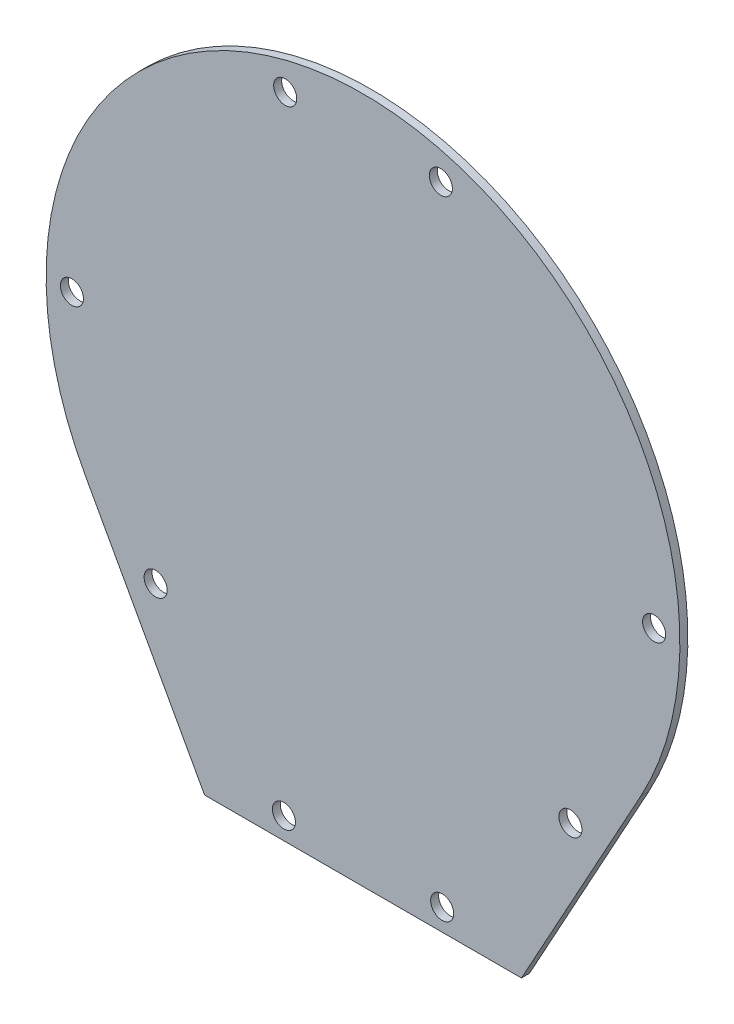
ISO-10303-21;
HEADER;
FILE_DESCRIPTION(('STEP AP214'),'2;1');
FILE_NAME('part.step','',(''),(''),'','','');
FILE_SCHEMA(('AUTOMOTIVE_DESIGN { 1 0 10303 214 1 1 1 1 }'));
ENDSEC;
DATA;
#1=APPLICATION_CONTEXT('core data for automotive mechanical design processes');
#2=APPLICATION_PROTOCOL_DEFINITION('international standard','automotive_design',2000,#1);
#3=PRODUCT_CONTEXT('',#1,'mechanical');
#4=PRODUCT('Part','Part','',(#3));
#5=PRODUCT_RELATED_PRODUCT_CATEGORY('part','',(#4));
#6=PRODUCT_DEFINITION_FORMATION('','',#4);
#7=PRODUCT_DEFINITION_CONTEXT('part definition',#1,'design');
#8=PRODUCT_DEFINITION('design','',#6,#7);
#9=PRODUCT_DEFINITION_SHAPE('','',#8);
#10=(LENGTH_UNIT() NAMED_UNIT(*) SI_UNIT(.MILLI.,.METRE.));
#11=(NAMED_UNIT(*) PLANE_ANGLE_UNIT() SI_UNIT($,.RADIAN.));
#12=(NAMED_UNIT(*) SI_UNIT($,.STERADIAN.) SOLID_ANGLE_UNIT());
#13=UNCERTAINTY_MEASURE_WITH_UNIT(LENGTH_MEASURE(1.E-05),#10,'distance_accuracy_value','');
#14=(GEOMETRIC_REPRESENTATION_CONTEXT(3) GLOBAL_UNCERTAINTY_ASSIGNED_CONTEXT((#13)) GLOBAL_UNIT_ASSIGNED_CONTEXT((#10,
#11,#12)) REPRESENTATION_CONTEXT('',''));
#15=CARTESIAN_POINT('',(0.,0.,0.));
#16=DIRECTION('',(0.,0.,1.));
#17=DIRECTION('',(1.,0.,0.));
#18=AXIS2_PLACEMENT_3D('',#15,#16,#17);
#19=CARTESIAN_POINT('',(0.,0.,0.75438));
#20=DIRECTION('',(0.,0.,1.));
#21=DIRECTION('',(1.,0.,0.));
#22=AXIS2_PLACEMENT_3D('',#19,#20,#21);
#23=PLANE('',#22);
#24=CARTESIAN_POINT('',(27.559,-0.045002199999999,0.75438));
#25=DIRECTION('',(0.,0.,1.));
#26=DIRECTION('',(1.,0.,0.));
#27=AXIS2_PLACEMENT_3D('',#24,#25,#26);
#28=CIRCLE('',#27,1.09200001);
#29=CARTESIAN_POINT('',(28.65100001,-0.045002199999999,0.75438));
#30=VERTEX_POINT('',#29);
#31=EDGE_CURVE('E228',#30,#30,#28,.F.);
#32=ORIENTED_EDGE('',*,*,#31,.T.);
#33=EDGE_LOOP('',(#32));
#34=FACE_BOUND('',#33,.T.);
#35=CARTESIAN_POINT('',(19.634,-19.9840012,0.75438));
#36=DIRECTION('',(0.,0.,1.));
#37=DIRECTION('',(1.,0.,0.));
#38=AXIS2_PLACEMENT_3D('',#35,#36,#37);
#39=CIRCLE('',#38,1.09200001);
#40=CARTESIAN_POINT('',(20.72600001,-19.9840012,0.75438));
#41=VERTEX_POINT('',#40);
#42=EDGE_CURVE('E237',#41,#41,#39,.F.);
#43=ORIENTED_EDGE('',*,*,#42,.T.);
#44=EDGE_LOOP('',(#43));
#45=FACE_BOUND('',#44,.T.);
#46=CARTESIAN_POINT('',(7.4931,-32.938,0.75438));
#47=DIRECTION('',(0.,0.,1.));
#48=DIRECTION('',(1.,0.,0.));
#49=AXIS2_PLACEMENT_3D('',#46,#47,#48);
#50=CIRCLE('',#49,1.09200001);
#51=CARTESIAN_POINT('',(8.58510001,-32.938,0.75438));
#52=VERTEX_POINT('',#51);
#53=EDGE_CURVE('E232',#52,#52,#50,.F.);
#54=ORIENTED_EDGE('',*,*,#53,.T.);
#55=EDGE_LOOP('',(#54));
#56=FACE_BOUND('',#55,.T.);
#57=CARTESIAN_POINT('',(7.366,26.4469878,0.75438));
#58=DIRECTION('',(0.,0.,1.));
#59=DIRECTION('',(1.,0.,0.));
#60=AXIS2_PLACEMENT_3D('',#57,#58,#59);
#61=CIRCLE('',#60,1.09200001);
#62=CARTESIAN_POINT('',(8.45800001,26.4469878,0.75438));
#63=VERTEX_POINT('',#62);
#64=EDGE_CURVE('E135',#63,#63,#61,.F.);
#65=ORIENTED_EDGE('',*,*,#64,.T.);
#66=EDGE_LOOP('',(#65));
#67=FACE_BOUND('',#66,.T.);
#68=DIRECTION('',(0.481530219319478,0.876429488254552,0.));
#69=VECTOR('',#68,1.);
#70=CARTESIAN_POINT('',(26.2928846476366,-14.4459065795843,0.75438));
#71=LINE('',#70,#69);
#72=CARTESIAN_POINT('',(15.,-35.,0.75438));
#73=VERTEX_POINT('',#72);
#74=CARTESIAN_POINT('',(26.2928846476366,-14.4459065795843,0.75438));
#75=VERTEX_POINT('',#74);
#76=EDGE_CURVE('E95',#73,#75,#71,.T.);
#77=ORIENTED_EDGE('',*,*,#76,.T.);
#78=CARTESIAN_POINT('',(0.,0.,0.75438));
#79=DIRECTION('',(0.,0.,1.));
#80=DIRECTION('',(1.,0.,0.));
#81=AXIS2_PLACEMENT_3D('',#78,#79,#80);
#82=CIRCLE('',#81,30.);
#83=CARTESIAN_POINT('',(-26.2928846476366,-14.4459065795843,0.75438));
#84=VERTEX_POINT('',#83);
#85=EDGE_CURVE('E90',#75,#84,#82,.T.);
#86=ORIENTED_EDGE('',*,*,#85,.T.);
#87=DIRECTION('',(-0.481530219319478,0.876429488254552,0.));
#88=VECTOR('',#87,1.);
#89=CARTESIAN_POINT('',(-26.2928846476366,-14.4459065795843,0.75438));
#90=LINE('',#89,#88);
#91=CARTESIAN_POINT('',(-15.,-35.,0.75438));
#92=VERTEX_POINT('',#91);
#93=EDGE_CURVE('E93',#92,#84,#90,.T.);
#94=ORIENTED_EDGE('',*,*,#93,.F.);
#95=DIRECTION('',(1.,0.,0.));
#96=VECTOR('',#95,1.);
#97=CARTESIAN_POINT('',(0.,-35.,0.75438));
#98=LINE('',#97,#96);
#99=EDGE_CURVE('E64',#92,#73,#98,.T.);
#100=ORIENTED_EDGE('',*,*,#99,.T.);
#101=EDGE_LOOP('',(#77,#86,#94,#100));
#102=FACE_BOUND('',#101,.T.);
#103=CARTESIAN_POINT('',(-7.366,26.4469878,0.75438));
#104=DIRECTION('',(0.,0.,1.));
#105=DIRECTION('',(1.,0.,0.));
#106=AXIS2_PLACEMENT_3D('',#103,#104,#105);
#107=CIRCLE('',#106,1.09200001);
#108=CARTESIAN_POINT('',(-6.27399999,26.4469878,0.75438));
#109=VERTEX_POINT('',#108);
#110=EDGE_CURVE('E243',#109,#109,#107,.T.);
#111=ORIENTED_EDGE('',*,*,#110,.F.);
#112=EDGE_LOOP('',(#111));
#113=FACE_BOUND('',#112,.T.);
#114=CARTESIAN_POINT('',(-27.559,-0.045002199999999,0.75438));
#115=DIRECTION('',(0.,0.,1.));
#116=DIRECTION('',(1.,0.,0.));
#117=AXIS2_PLACEMENT_3D('',#114,#115,#116);
#118=CIRCLE('',#117,1.09200001);
#119=CARTESIAN_POINT('',(-26.46699999,-0.045002199999999,0.75438));
#120=VERTEX_POINT('',#119);
#121=EDGE_CURVE('E247',#120,#120,#118,.T.);
#122=ORIENTED_EDGE('',*,*,#121,.F.);
#123=EDGE_LOOP('',(#122));
#124=FACE_BOUND('',#123,.T.);
#125=CARTESIAN_POINT('',(-19.634,-19.9840012,0.75438));
#126=DIRECTION('',(0.,0.,1.));
#127=DIRECTION('',(1.,0.,0.));
#128=AXIS2_PLACEMENT_3D('',#125,#126,#127);
#129=CIRCLE('',#128,1.09200001);
#130=CARTESIAN_POINT('',(-18.54199999,-19.9840012,0.75438));
#131=VERTEX_POINT('',#130);
#132=EDGE_CURVE('E233',#131,#131,#129,.T.);
#133=ORIENTED_EDGE('',*,*,#132,.F.);
#134=EDGE_LOOP('',(#133));
#135=FACE_BOUND('',#134,.T.);
#136=CARTESIAN_POINT('',(-7.4931,-32.938,0.75438));
#137=DIRECTION('',(0.,0.,1.));
#138=DIRECTION('',(1.,0.,0.));
#139=AXIS2_PLACEMENT_3D('',#136,#137,#138);
#140=CIRCLE('',#139,1.09200001);
#141=CARTESIAN_POINT('',(-6.40109999,-32.938,0.75438));
#142=VERTEX_POINT('',#141);
#143=EDGE_CURVE('E229',#142,#142,#140,.T.);
#144=ORIENTED_EDGE('',*,*,#143,.F.);
#145=EDGE_LOOP('',(#144));
#146=FACE_BOUND('',#145,.T.);
#147=ADVANCED_FACE('F44',(#34,#45,#56,#67,#102,#113,#124,#135,#146),#23,.T.);
#148=CARTESIAN_POINT('',(0.,0.,0.));
#149=DIRECTION('',(0.,0.,1.));
#150=DIRECTION('',(1.,0.,0.));
#151=AXIS2_PLACEMENT_3D('',#148,#149,#150);
#152=PLANE('',#151);
#153=CARTESIAN_POINT('',(27.559,-0.045002199999999,0.));
#154=DIRECTION('',(0.,0.,1.));
#155=DIRECTION('',(1.,0.,0.));
#156=AXIS2_PLACEMENT_3D('',#153,#154,#155);
#157=CIRCLE('',#156,1.09200001);
#158=CARTESIAN_POINT('',(28.65100001,-0.045002199999999,0.));
#159=VERTEX_POINT('',#158);
#160=EDGE_CURVE('E48',#159,#159,#157,.F.);
#161=ORIENTED_EDGE('',*,*,#160,.F.);
#162=EDGE_LOOP('',(#161));
#163=FACE_BOUND('',#162,.T.);
#164=CARTESIAN_POINT('',(19.634,-19.9840012,0.));
#165=DIRECTION('',(0.,0.,1.));
#166=DIRECTION('',(1.,0.,0.));
#167=AXIS2_PLACEMENT_3D('',#164,#165,#166);
#168=CIRCLE('',#167,1.09200001);
#169=CARTESIAN_POINT('',(20.72600001,-19.9840012,0.));
#170=VERTEX_POINT('',#169);
#171=EDGE_CURVE('E154',#170,#170,#168,.F.);
#172=ORIENTED_EDGE('',*,*,#171,.F.);
#173=EDGE_LOOP('',(#172));
#174=FACE_BOUND('',#173,.T.);
#175=CARTESIAN_POINT('',(7.4931,-32.938,0.));
#176=DIRECTION('',(0.,0.,1.));
#177=DIRECTION('',(1.,0.,0.));
#178=AXIS2_PLACEMENT_3D('',#175,#176,#177);
#179=CIRCLE('',#178,1.09200001);
#180=CARTESIAN_POINT('',(8.58510001,-32.938,0.));
#181=VERTEX_POINT('',#180);
#182=EDGE_CURVE('E151',#181,#181,#179,.F.);
#183=ORIENTED_EDGE('',*,*,#182,.F.);
#184=EDGE_LOOP('',(#183));
#185=FACE_BOUND('',#184,.T.);
#186=CARTESIAN_POINT('',(-19.634,-19.9840012,0.));
#187=DIRECTION('',(0.,0.,1.));
#188=DIRECTION('',(1.,0.,0.));
#189=AXIS2_PLACEMENT_3D('',#186,#187,#188);
#190=CIRCLE('',#189,1.09200001);
#191=CARTESIAN_POINT('',(-18.54199999,-19.9840012,0.));
#192=VERTEX_POINT('',#191);
#193=EDGE_CURVE('E143',#192,#192,#190,.T.);
#194=ORIENTED_EDGE('',*,*,#193,.T.);
#195=EDGE_LOOP('',(#194));
#196=FACE_BOUND('',#195,.T.);
#197=CARTESIAN_POINT('',(-7.366,26.4469878,0.));
#198=DIRECTION('',(0.,0.,1.));
#199=DIRECTION('',(1.,0.,0.));
#200=AXIS2_PLACEMENT_3D('',#197,#198,#199);
#201=CIRCLE('',#200,1.09200001);
#202=CARTESIAN_POINT('',(-6.27399999,26.4469878,0.));
#203=VERTEX_POINT('',#202);
#204=EDGE_CURVE('E134',#203,#203,#201,.T.);
#205=ORIENTED_EDGE('',*,*,#204,.T.);
#206=EDGE_LOOP('',(#205));
#207=FACE_BOUND('',#206,.T.);
#208=CARTESIAN_POINT('',(7.366,26.4469878,0.));
#209=DIRECTION('',(0.,0.,1.));
#210=DIRECTION('',(1.,0.,0.));
#211=AXIS2_PLACEMENT_3D('',#208,#209,#210);
#212=CIRCLE('',#211,1.09200001);
#213=CARTESIAN_POINT('',(8.45800001,26.4469878,0.));
#214=VERTEX_POINT('',#213);
#215=EDGE_CURVE('E130',#214,#214,#212,.F.);
#216=ORIENTED_EDGE('',*,*,#215,.F.);
#217=EDGE_LOOP('',(#216));
#218=FACE_BOUND('',#217,.T.);
#219=DIRECTION('',(0.481530219319478,0.876429488254552,0.));
#220=VECTOR('',#219,1.);
#221=CARTESIAN_POINT('',(26.2928846476366,-14.4459065795843,0.));
#222=LINE('',#221,#220);
#223=CARTESIAN_POINT('',(15.,-35.,0.));
#224=VERTEX_POINT('',#223);
#225=CARTESIAN_POINT('',(26.2928846476366,-14.4459065795843,0.));
#226=VERTEX_POINT('',#225);
#227=EDGE_CURVE('E115',#224,#226,#222,.T.);
#228=ORIENTED_EDGE('',*,*,#227,.F.);
#229=DIRECTION('',(1.,0.,0.));
#230=VECTOR('',#229,1.);
#231=CARTESIAN_POINT('',(0.,-35.,0.));
#232=LINE('',#231,#230);
#233=CARTESIAN_POINT('',(-15.,-35.,0.));
#234=VERTEX_POINT('',#233);
#235=EDGE_CURVE('E83',#234,#224,#232,.T.);
#236=ORIENTED_EDGE('',*,*,#235,.F.);
#237=DIRECTION('',(-0.481530219319478,0.876429488254552,0.));
#238=VECTOR('',#237,1.);
#239=CARTESIAN_POINT('',(-26.2928846476366,-14.4459065795843,0.));
#240=LINE('',#239,#238);
#241=CARTESIAN_POINT('',(-26.2928846476366,-14.4459065795843,0.));
#242=VERTEX_POINT('',#241);
#243=EDGE_CURVE('E121',#234,#242,#240,.T.);
#244=ORIENTED_EDGE('',*,*,#243,.T.);
#245=CARTESIAN_POINT('',(0.,0.,0.));
#246=DIRECTION('',(0.,0.,1.));
#247=DIRECTION('',(1.,0.,0.));
#248=AXIS2_PLACEMENT_3D('',#245,#246,#247);
#249=CIRCLE('',#248,30.);
#250=EDGE_CURVE('E101',#226,#242,#249,.T.);
#251=ORIENTED_EDGE('',*,*,#250,.F.);
#252=EDGE_LOOP('',(#228,#236,#244,#251));
#253=FACE_BOUND('',#252,.T.);
#254=CARTESIAN_POINT('',(-27.559,-0.045002199999999,0.));
#255=DIRECTION('',(0.,0.,1.));
#256=DIRECTION('',(1.,0.,0.));
#257=AXIS2_PLACEMENT_3D('',#254,#255,#256);
#258=CIRCLE('',#257,1.09200001);
#259=CARTESIAN_POINT('',(-26.46699999,-0.045002199999999,0.));
#260=VERTEX_POINT('',#259);
#261=EDGE_CURVE('E139',#260,#260,#258,.T.);
#262=ORIENTED_EDGE('',*,*,#261,.T.);
#263=EDGE_LOOP('',(#262));
#264=FACE_BOUND('',#263,.T.);
#265=CARTESIAN_POINT('',(-7.4931,-32.938,0.));
#266=DIRECTION('',(0.,0.,1.));
#267=DIRECTION('',(1.,0.,0.));
#268=AXIS2_PLACEMENT_3D('',#265,#266,#267);
#269=CIRCLE('',#268,1.09200001);
#270=CARTESIAN_POINT('',(-6.40109999,-32.938,0.));
#271=VERTEX_POINT('',#270);
#272=EDGE_CURVE('E147',#271,#271,#269,.T.);
#273=ORIENTED_EDGE('',*,*,#272,.T.);
#274=EDGE_LOOP('',(#273));
#275=FACE_BOUND('',#274,.T.);
#276=ADVANCED_FACE('F165',(#163,#174,#185,#196,#207,#218,#253,#264,#275),#152,.F.);
#277=CARTESIAN_POINT('',(26.2928846476366,-14.4459065795843,0.75438));
#278=DIRECTION('',(-0.876429488254551,0.481530219319478,0.));
#279=DIRECTION('',(-0.481530219319478,-0.876429488254552,0.));
#280=AXIS2_PLACEMENT_3D('',#277,#278,#279);
#281=PLANE('',#280);
#282=ORIENTED_EDGE('',*,*,#227,.T.);
#283=DIRECTION('',(0.,0.,-1.));
#284=VECTOR('',#283,1.);
#285=CARTESIAN_POINT('',(26.2928846476366,-14.4459065795843,0.75438));
#286=LINE('',#285,#284);
#287=EDGE_CURVE('E11',#75,#226,#286,.T.);
#288=ORIENTED_EDGE('',*,*,#287,.F.);
#289=ORIENTED_EDGE('',*,*,#76,.F.);
#290=DIRECTION('',(0.,0.,-1.));
#291=VECTOR('',#290,1.);
#292=CARTESIAN_POINT('',(15.,-35.,0.75438));
#293=LINE('',#292,#291);
#294=EDGE_CURVE('E111',#73,#224,#293,.T.);
#295=ORIENTED_EDGE('',*,*,#294,.T.);
#296=EDGE_LOOP('',(#282,#288,#289,#295));
#297=FACE_BOUND('',#296,.T.);
#298=ADVANCED_FACE('F46',(#297),#281,.F.);
#299=CARTESIAN_POINT('',(0.,0.,0.75438));
#300=DIRECTION('',(0.,0.,-1.));
#301=DIRECTION('',(-1.,0.,0.));
#302=AXIS2_PLACEMENT_3D('',#299,#300,#301);
#303=CYLINDRICAL_SURFACE('',#302,30.);
#304=ORIENTED_EDGE('',*,*,#250,.T.);
#305=DIRECTION('',(0.,0.,-1.));
#306=VECTOR('',#305,1.);
#307=CARTESIAN_POINT('',(-26.2928846476366,-14.4459065795843,0.75438));
#308=LINE('',#307,#306);
#309=EDGE_CURVE('E55',#84,#242,#308,.T.);
#310=ORIENTED_EDGE('',*,*,#309,.F.);
#311=ORIENTED_EDGE('',*,*,#85,.F.);
#312=ORIENTED_EDGE('',*,*,#287,.T.);
#313=EDGE_LOOP('',(#304,#310,#311,#312));
#314=FACE_BOUND('',#313,.T.);
#315=ADVANCED_FACE('F100',(#314),#303,.T.);
#316=CARTESIAN_POINT('',(-26.2928846476366,-14.4459065795843,0.75438));
#317=DIRECTION('',(-0.876429488254552,-0.481530219319478,0.));
#318=DIRECTION('',(0.481530219319478,-0.876429488254552,0.));
#319=AXIS2_PLACEMENT_3D('',#316,#317,#318);
#320=PLANE('',#319);
#321=ORIENTED_EDGE('',*,*,#243,.F.);
#322=DIRECTION('',(0.,0.,-1.));
#323=VECTOR('',#322,1.);
#324=CARTESIAN_POINT('',(-15.,-35.,0.75438));
#325=LINE('',#324,#323);
#326=EDGE_CURVE('E80',#92,#234,#325,.T.);
#327=ORIENTED_EDGE('',*,*,#326,.F.);
#328=ORIENTED_EDGE('',*,*,#93,.T.);
#329=ORIENTED_EDGE('',*,*,#309,.T.);
#330=EDGE_LOOP('',(#321,#327,#328,#329));
#331=FACE_BOUND('',#330,.T.);
#332=ADVANCED_FACE('F107',(#331),#320,.T.);
#333=CARTESIAN_POINT('',(0.,-35.,0.75438));
#334=DIRECTION('',(0.,1.,0.));
#335=DIRECTION('',(0.,0.,1.));
#336=AXIS2_PLACEMENT_3D('',#333,#334,#335);
#337=PLANE('',#336);
#338=ORIENTED_EDGE('',*,*,#235,.T.);
#339=ORIENTED_EDGE('',*,*,#294,.F.);
#340=ORIENTED_EDGE('',*,*,#99,.F.);
#341=ORIENTED_EDGE('',*,*,#326,.T.);
#342=EDGE_LOOP('',(#338,#339,#340,#341));
#343=FACE_BOUND('',#342,.T.);
#344=ADVANCED_FACE('F212',(#343),#337,.F.);
#345=CARTESIAN_POINT('',(7.366,26.4469878,-9.24562));
#346=DIRECTION('',(0.,0.,1.));
#347=DIRECTION('',(1.,0.,0.));
#348=AXIS2_PLACEMENT_3D('',#345,#346,#347);
#349=CYLINDRICAL_SURFACE('',#348,1.09200001);
#350=ORIENTED_EDGE('',*,*,#64,.F.);
#351=EDGE_LOOP('',(#350));
#352=FACE_BOUND('',#351,.T.);
#353=ORIENTED_EDGE('',*,*,#215,.T.);
#354=EDGE_LOOP('',(#353));
#355=FACE_BOUND('',#354,.T.);
#356=ADVANCED_FACE('F210',(#352,#355),#349,.F.);
#357=CARTESIAN_POINT('',(-7.366,26.4469878,-9.24562));
#358=DIRECTION('',(0.,0.,1.));
#359=DIRECTION('',(1.,0.,0.));
#360=AXIS2_PLACEMENT_3D('',#357,#358,#359);
#361=CYLINDRICAL_SURFACE('',#360,1.09200001);
#362=ORIENTED_EDGE('',*,*,#110,.T.);
#363=EDGE_LOOP('',(#362));
#364=FACE_BOUND('',#363,.T.);
#365=ORIENTED_EDGE('',*,*,#204,.F.);
#366=EDGE_LOOP('',(#365));
#367=FACE_BOUND('',#366,.T.);
#368=ADVANCED_FACE('F263',(#364,#367),#361,.F.);
#369=CARTESIAN_POINT('',(-27.559,-0.045002199999999,-9.24562));
#370=DIRECTION('',(0.,0.,1.));
#371=DIRECTION('',(1.,0.,0.));
#372=AXIS2_PLACEMENT_3D('',#369,#370,#371);
#373=CYLINDRICAL_SURFACE('',#372,1.09200001);
#374=ORIENTED_EDGE('',*,*,#121,.T.);
#375=EDGE_LOOP('',(#374));
#376=FACE_BOUND('',#375,.T.);
#377=ORIENTED_EDGE('',*,*,#261,.F.);
#378=EDGE_LOOP('',(#377));
#379=FACE_BOUND('',#378,.T.);
#380=ADVANCED_FACE('F197',(#376,#379),#373,.F.);
#381=CARTESIAN_POINT('',(-19.634,-19.9840012,-9.24562));
#382=DIRECTION('',(0.,0.,1.));
#383=DIRECTION('',(1.,0.,0.));
#384=AXIS2_PLACEMENT_3D('',#381,#382,#383);
#385=CYLINDRICAL_SURFACE('',#384,1.09200001);
#386=ORIENTED_EDGE('',*,*,#132,.T.);
#387=EDGE_LOOP('',(#386));
#388=FACE_BOUND('',#387,.T.);
#389=ORIENTED_EDGE('',*,*,#193,.F.);
#390=EDGE_LOOP('',(#389));
#391=FACE_BOUND('',#390,.T.);
#392=ADVANCED_FACE('F187',(#388,#391),#385,.F.);
#393=CARTESIAN_POINT('',(-7.4931,-32.938,-9.24562));
#394=DIRECTION('',(0.,0.,1.));
#395=DIRECTION('',(1.,0.,0.));
#396=AXIS2_PLACEMENT_3D('',#393,#394,#395);
#397=CYLINDRICAL_SURFACE('',#396,1.09200001);
#398=ORIENTED_EDGE('',*,*,#143,.T.);
#399=EDGE_LOOP('',(#398));
#400=FACE_BOUND('',#399,.T.);
#401=ORIENTED_EDGE('',*,*,#272,.F.);
#402=EDGE_LOOP('',(#401));
#403=FACE_BOUND('',#402,.T.);
#404=ADVANCED_FACE('F184',(#400,#403),#397,.F.);
#405=CARTESIAN_POINT('',(7.4931,-32.938,-9.24562));
#406=DIRECTION('',(0.,0.,1.));
#407=DIRECTION('',(1.,0.,0.));
#408=AXIS2_PLACEMENT_3D('',#405,#406,#407);
#409=CYLINDRICAL_SURFACE('',#408,1.09200001);
#410=ORIENTED_EDGE('',*,*,#53,.F.);
#411=EDGE_LOOP('',(#410));
#412=FACE_BOUND('',#411,.T.);
#413=ORIENTED_EDGE('',*,*,#182,.T.);
#414=EDGE_LOOP('',(#413));
#415=FACE_BOUND('',#414,.T.);
#416=ADVANCED_FACE('F186',(#412,#415),#409,.F.);
#417=CARTESIAN_POINT('',(19.634,-19.9840012,-9.24562));
#418=DIRECTION('',(0.,0.,1.));
#419=DIRECTION('',(1.,0.,0.));
#420=AXIS2_PLACEMENT_3D('',#417,#418,#419);
#421=CYLINDRICAL_SURFACE('',#420,1.09200001);
#422=ORIENTED_EDGE('',*,*,#42,.F.);
#423=EDGE_LOOP('',(#422));
#424=FACE_BOUND('',#423,.T.);
#425=ORIENTED_EDGE('',*,*,#171,.T.);
#426=EDGE_LOOP('',(#425));
#427=FACE_BOUND('',#426,.T.);
#428=ADVANCED_FACE('F194',(#424,#427),#421,.F.);
#429=CARTESIAN_POINT('',(27.559,-0.045002199999999,-9.24562));
#430=DIRECTION('',(0.,0.,1.));
#431=DIRECTION('',(1.,0.,0.));
#432=AXIS2_PLACEMENT_3D('',#429,#430,#431);
#433=CYLINDRICAL_SURFACE('',#432,1.09200001);
#434=ORIENTED_EDGE('',*,*,#31,.F.);
#435=EDGE_LOOP('',(#434));
#436=FACE_BOUND('',#435,.T.);
#437=ORIENTED_EDGE('',*,*,#160,.T.);
#438=EDGE_LOOP('',(#437));
#439=FACE_BOUND('',#438,.T.);
#440=ADVANCED_FACE('F163',(#436,#439),#433,.F.);
#441=CLOSED_SHELL('',(#147,#276,#298,#315,#332,#344,#356,#368,#380,#392,#404,#416,#428,#440));
#442=MANIFOLD_SOLID_BREP('B2',#441);
#443=ADVANCED_BREP_SHAPE_REPRESENTATION('',(#18,#442),#14);
#444=SHAPE_DEFINITION_REPRESENTATION(#9,#443);
ENDSEC;
END-ISO-10303-21;
